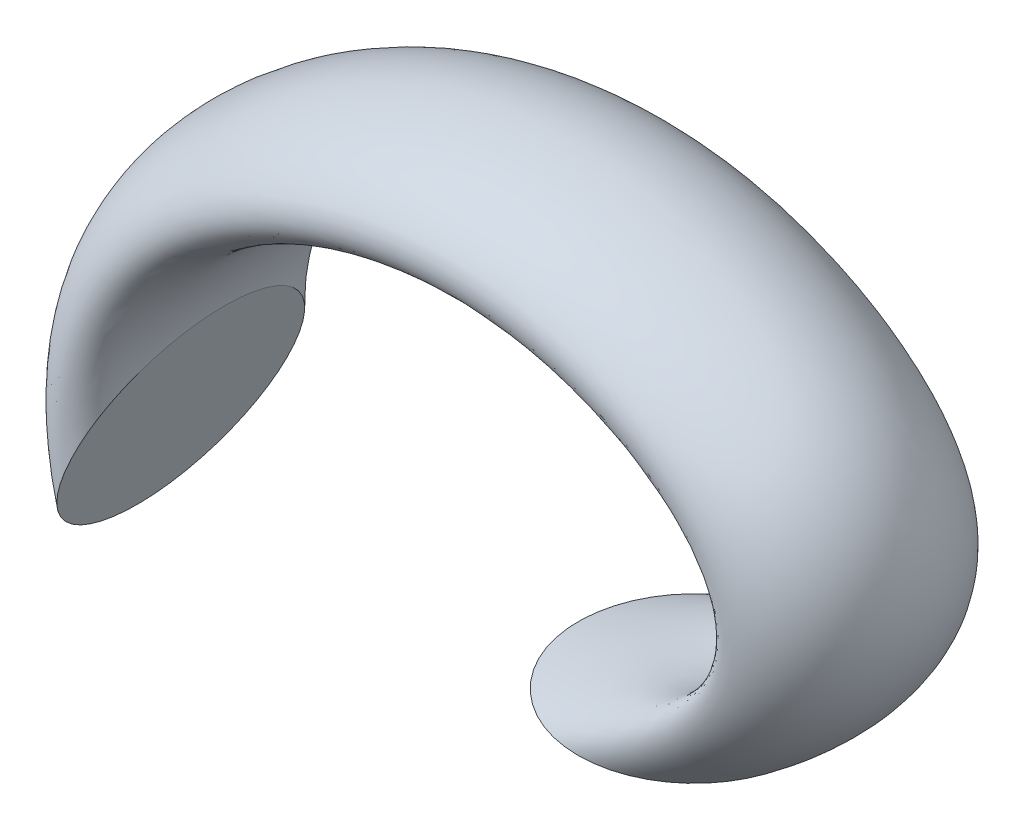
ISO-10303-21;
HEADER;
FILE_DESCRIPTION(('STEP AP214'),'2;1');
FILE_NAME('part.step','',(''),(''),'','','');
FILE_SCHEMA(('AUTOMOTIVE_DESIGN { 1 0 10303 214 1 1 1 1 }'));
ENDSEC;
DATA;
#1=APPLICATION_CONTEXT('core data for automotive mechanical design processes');
#2=APPLICATION_PROTOCOL_DEFINITION('international standard','automotive_design',2000,#1);
#3=PRODUCT_CONTEXT('',#1,'mechanical');
#4=PRODUCT('Part','Part','',(#3));
#5=PRODUCT_RELATED_PRODUCT_CATEGORY('part','',(#4));
#6=PRODUCT_DEFINITION_FORMATION('','',#4);
#7=PRODUCT_DEFINITION_CONTEXT('part definition',#1,'design');
#8=PRODUCT_DEFINITION('design','',#6,#7);
#9=PRODUCT_DEFINITION_SHAPE('','',#8);
#10=(LENGTH_UNIT() NAMED_UNIT(*) SI_UNIT(.MILLI.,.METRE.));
#11=(NAMED_UNIT(*) PLANE_ANGLE_UNIT() SI_UNIT($,.RADIAN.));
#12=(NAMED_UNIT(*) SI_UNIT($,.STERADIAN.) SOLID_ANGLE_UNIT());
#13=UNCERTAINTY_MEASURE_WITH_UNIT(LENGTH_MEASURE(1.E-05),#10,'distance_accuracy_value','');
#14=(GEOMETRIC_REPRESENTATION_CONTEXT(3) GLOBAL_UNCERTAINTY_ASSIGNED_CONTEXT((#13)) GLOBAL_UNIT_ASSIGNED_CONTEXT((#10,
#11,#12)) REPRESENTATION_CONTEXT('',''));
#15=CARTESIAN_POINT('',(0.,0.,0.));
#16=DIRECTION('',(0.,0.,1.));
#17=DIRECTION('',(1.,0.,0.));
#18=AXIS2_PLACEMENT_3D('',#15,#16,#17);
#19=CARTESIAN_POINT('',(43.7788582991507,0.,68.9517018211618));
#20=DIRECTION('',(0.,1.,0.));
#21=DIRECTION('',(0.,0.,1.));
#22=AXIS2_PLACEMENT_3D('',#19,#20,#21);
#23=PLANE('',#22);
#24=CARTESIAN_POINT('',(43.7788582991507,0.,68.9517018211618));
#25=DIRECTION('',(0.,1.,0.));
#26=DIRECTION('',(0.,0.,1.));
#27=AXIS2_PLACEMENT_3D('',#24,#25,#26);
#28=CIRCLE('',#27,52.3683720405535);
#29=CARTESIAN_POINT('',(43.7788582991507,0.,121.320073861715));
#30=VERTEX_POINT('',#29);
#31=EDGE_CURVE('E50',#30,#30,#28,.T.);
#32=ORIENTED_EDGE('',*,*,#31,.F.);
#33=EDGE_LOOP('',(#32));
#34=FACE_BOUND('',#33,.T.);
#35=ADVANCED_FACE('F43',(#34),#23,.F.);
#36=CARTESIAN_POINT('',(-187.880643247411,-5.14997576686938,68.9517018211618));
#37=DIRECTION('',(0.92733372595367,-0.374235434865384,0.));
#38=DIRECTION('',(0.,0.,1.));
#39=AXIS2_PLACEMENT_3D('',#36,#37,#38);
#40=PLANE('',#39);
#41=CARTESIAN_POINT('',(-187.880643247411,-5.14997576686938,68.9517018211618));
#42=DIRECTION('',(0.92733372595367,-0.374235434865384,0.));
#43=DIRECTION('',(0.,0.,1.));
#44=AXIS2_PLACEMENT_3D('',#41,#42,#43);
#45=CIRCLE('',#44,52.3683720405535);
#46=CARTESIAN_POINT('',(-187.880643247411,-5.14997576686938,121.320073861715));
#47=VERTEX_POINT('',#46);
#48=EDGE_CURVE('E10',#47,#47,#45,.T.);
#49=ORIENTED_EDGE('',*,*,#48,.T.);
#50=EDGE_LOOP('',(#49));
#51=FACE_BOUND('',#50,.T.);
#52=ADVANCED_FACE('F60',(#51),#40,.T.);
#53=CARTESIAN_POINT('',(43.7788582991507,0.,121.320073861715));
#54=CARTESIAN_POINT('',(50.8208120673313,3.86348954815709,121.320073861715));
#55=CARTESIAN_POINT('',(57.2136849046735,7.73593709271516,121.320073861715));
#56=CARTESIAN_POINT('',(68.7764045608907,15.4767923931756,121.320073861715));
#57=CARTESIAN_POINT('',(73.9462513797051,19.3452001490155,121.320073861715));
#58=CARTESIAN_POINT('',(83.1380548427577,27.0560200901852,121.320073861715));
#59=CARTESIAN_POINT('',(87.1600114869644,30.8984322755763,121.320073861715));
#60=CARTESIAN_POINT('',(94.1311704450205,38.5353052946656,121.320073861715));
#61=CARTESIAN_POINT('',(97.080372758458,42.329766128045,121.320073861715));
#62=CARTESIAN_POINT('',(101.98115889866,49.8487806612818,121.320073861715));
#63=CARTESIAN_POINT('',(103.93274272514,53.5733343612022,121.320073861715));
#64=CARTESIAN_POINT('',(106.913427735708,60.9305788455651,121.320073861715));
#65=CARTESIAN_POINT('',(107.942528919063,64.5632696302483,121.320073861715));
#66=CARTESIAN_POINT('',(109.153384487101,71.7148325026277,121.320073861715));
#67=CARTESIAN_POINT('',(109.335138871296,75.2337045904485,121.320073861715));
#68=CARTESIAN_POINT('',(108.926436684757,82.1356742875165,121.320073861715));
#69=CARTESIAN_POINT('',(108.335980113503,85.5187718969647,121.320073861715));
#70=CARTESIAN_POINT('',(106.45799186,92.1272368553821,121.320073861715));
#71=CARTESIAN_POINT('',(105.170460177127,95.3526042047788,121.320073861715));
#72=CARTESIAN_POINT('',(101.973457544373,101.623652861554,121.320073861715));
#73=CARTESIAN_POINT('',(100.063986593798,104.669334169197,121.320073861715));
#74=CARTESIAN_POINT('',(95.6982412692335,110.55905496104,121.320073861715));
#75=CARTESIAN_POINT('',(93.2419668947788,113.403094445349,121.320073861715));
#76=CARTESIAN_POINT('',(87.8577505663072,118.867575809021,121.320073861715));
#77=CARTESIAN_POINT('',(84.9298086117539,121.488017688432,121.320073861715));
#78=CARTESIAN_POINT('',(75.5511851444674,128.981013246702,121.320073861715));
#79=CARTESIAN_POINT('',(68.5057060267381,133.485236846057,121.320073861715));
#80=CARTESIAN_POINT('',(53.4297075975193,141.33582424521,121.320073861715));
#81=CARTESIAN_POINT('',(45.3991882854172,144.682188045618,121.320073861715));
#82=CARTESIAN_POINT('',(24.1838410922433,151.596009917086,121.320073861715));
#83=CARTESIAN_POINT('',(10.7116427782938,154.165403727354,121.320073861715));
#84=CARTESIAN_POINT('',(-16.4929882116219,156.230463330812,121.320073861715));
#85=CARTESIAN_POINT('',(-30.225420887943,155.726129122161,121.320073861715));
#86=CARTESIAN_POINT('',(-57.2520606588267,151.899639242845,121.320073861715));
#87=CARTESIAN_POINT('',(-70.5462677532173,148.577483571402,121.320073861715));
#88=CARTESIAN_POINT('',(-95.9979964148526,139.371257320852,121.320073861715));
#89=CARTESIAN_POINT('',(-108.1555179827,133.487186741725,121.320073861715));
#90=CARTESIAN_POINT('',(-130.635415646024,119.41303723052,121.320073861715));
#91=CARTESIAN_POINT('',(-140.957791742216,111.222958299156,121.320073861715));
#92=CARTESIAN_POINT('',(-154.541151824065,97.4002635534034,121.320073861715));
#93=CARTESIAN_POINT('',(-158.752237841053,92.5364359138809,121.320073861715));
#94=CARTESIAN_POINT('',(-166.453701027593,82.3282435042159,121.320073861715));
#95=CARTESIAN_POINT('',(-169.944078197276,76.9838787347264,121.320073861715));
#96=CARTESIAN_POINT('',(-176.116816196809,65.8466003850512,121.320073861715));
#97=CARTESIAN_POINT('',(-178.799177026208,60.0536868049968,121.320073861715));
#98=CARTESIAN_POINT('',(-183.268574851776,48.0512991538965,121.320073861715));
#99=CARTESIAN_POINT('',(-185.055611847982,41.8418250828134,121.320073861715));
#100=CARTESIAN_POINT('',(-187.647054513801,29.0383047691713,121.320073861715));
#101=CARTESIAN_POINT('',(-188.451460183446,22.4442585264733,121.320073861715));
#102=CARTESIAN_POINT('',(-188.990332703469,8.90358218912008,121.320073861715));
#103=CARTESIAN_POINT('',(-188.724799553583,1.95695209433072,121.320073861715));
#104=CARTESIAN_POINT('',(-187.880643247411,-5.14997576686938,121.320073861715));
#105=CARTESIAN_POINT('',(148.515602380258,0.,121.320073861715));
#106=CARTESIAN_POINT('',(155.557556148299,6.64583333488335,121.320073861715));
#107=CARTESIAN_POINT('',(161.842909409288,13.5714250583775,121.320073861715));
#108=CARTESIAN_POINT('',(172.807513026626,28.0806017988312,121.320073861715));
#109=CARTESIAN_POINT('',(177.487868708877,35.6660804671193,121.320073861715));
#110=CARTESIAN_POINT('',(185.050848000334,51.5717343214343,121.320073861715));
#111=CARTESIAN_POINT('',(187.933309443948,59.8960916493379,121.320073861715));
#112=CARTESIAN_POINT('',(191.586907276357,77.245784351496,121.320073861715));
#113=CARTESIAN_POINT('',(192.353228872741,86.2771370492782,121.320073861715));
#114=CARTESIAN_POINT('',(191.398489439186,104.738028441099,121.320073861715));
#115=CARTESIAN_POINT('',(189.665172226825,114.168900587686,121.320073861715));
#116=CARTESIAN_POINT('',(183.524097366581,132.71273131404,121.320073861715));
#117=CARTESIAN_POINT('',(179.106086102483,141.811618956173,121.320073861715));
#118=CARTESIAN_POINT('',(167.991164761324,158.718711478389,121.320073861715));
#119=CARTESIAN_POINT('',(161.305525038441,166.506575863498,121.320073861715));
#120=CARTESIAN_POINT('',(146.681252498693,180.147061135156,121.320073861715));
#121=CARTESIAN_POINT('',(138.765425419601,185.999824015252,121.320073861715));
#122=CARTESIAN_POINT('',(122.746618604627,195.843550015662,121.320073861715));
#123=CARTESIAN_POINT('',(114.650547879537,199.849871341193,121.320073861715));
#124=CARTESIAN_POINT('',(98.8473955110982,206.50348237289,121.320073861715));
#125=CARTESIAN_POINT('',(91.1336081766897,209.160553240774,121.320073861715));
#126=CARTESIAN_POINT('',(76.2116032774389,213.604857698251,121.320073861715));
#127=CARTESIAN_POINT('',(68.9962658571678,215.393582654131,121.320073861715));
#128=CARTESIAN_POINT('',(54.9792591209551,218.411126601134,121.320073861715));
#129=CARTESIAN_POINT('',(48.174036467855,219.638378411743,121.320073861715));
#130=CARTESIAN_POINT('',(28.1804859730203,222.707106530481,121.320073861715));
#131=CARTESIAN_POINT('',(15.3920280697379,223.960545966617,121.320073861715));
#132=CARTESIAN_POINT('',(-9.80826077921128,225.048449948724,121.320073861715));
#133=CARTESIAN_POINT('',(-22.2153385824235,224.865767450707,121.320073861715));
#134=CARTESIAN_POINT('',(-53.9611486348019,221.891185939983,121.320073861715));
#135=CARTESIAN_POINT('',(-72.7263017608972,217.96364821413,121.320073861715));
#136=CARTESIAN_POINT('',(-108.551295774159,206.800954699129,121.320073861715));
#137=CARTESIAN_POINT('',(-125.628347146845,199.558427046968,121.320073861715));
#138=CARTESIAN_POINT('',(-157.809697378949,182.084906799408,121.320073861715));
#139=CARTESIAN_POINT('',(-172.920261208228,171.844919043888,121.320073861715));
#140=CARTESIAN_POINT('',(-200.595071193078,148.385692259455,121.320073861715));
#141=CARTESIAN_POINT('',(-213.16234433155,135.156903718756,121.320073861715));
#142=CARTESIAN_POINT('',(-234.754972700049,105.689357930698,121.320073861715));
#143=CARTESIAN_POINT('',(-243.777258846104,89.4333468213764,121.320073861715));
#144=CARTESIAN_POINT('',(-253.571203350093,63.0193740762715,121.320073861715));
#145=CARTESIAN_POINT('',(-256.209016875631,53.880805627887,121.320073861715));
#146=CARTESIAN_POINT('',(-260.036759424675,35.059937911259,121.320073861715));
#147=CARTESIAN_POINT('',(-261.225173665042,25.3773984891202,121.320073861715));
#148=CARTESIAN_POINT('',(-261.989197019169,5.66851961631755,121.320073861715));
#149=CARTESIAN_POINT('',(-261.563055699231,-4.35693814923435,121.320073861715));
#150=CARTESIAN_POINT('',(-259.015338331173,-24.4815626565695,121.320073861715));
#151=CARTESIAN_POINT('',(-256.892871451983,-34.5784578538763,121.320073861715));
#152=CARTESIAN_POINT('',(-250.996576920667,-54.5529000454617,121.320073861715));
#153=CARTESIAN_POINT('',(-247.223841227708,-64.4277063527321,121.320073861715));
#154=CARTESIAN_POINT('',(-238.198326665279,-83.7220319025155,121.320073861715));
#155=CARTESIAN_POINT('',(-232.948385030257,-93.1401082959696,121.320073861715));
#156=CARTESIAN_POINT('',(-227.076844214988,-102.275890899858,121.320073861715));
#157=CARTESIAN_POINT('',(148.515602380258,0.,16.5833297806083));
#158=CARTESIAN_POINT('',(155.557556148355,6.64583333488335,16.5833297806083));
#159=CARTESIAN_POINT('',(161.842909409192,13.5714250583775,16.5833297806083));
#160=CARTESIAN_POINT('',(172.807513026722,28.0806017988312,16.5833297806083));
#161=CARTESIAN_POINT('',(177.487868708877,35.6660804671401,16.5833297806083));
#162=CARTESIAN_POINT('',(185.050848000334,51.5717343214135,16.5833297806083));
#163=CARTESIAN_POINT('',(187.933309443912,59.8960916493559,16.5833297806083));
#164=CARTESIAN_POINT('',(191.586907276393,77.245784351478,16.5833297806083));
#165=CARTESIAN_POINT('',(192.353228872678,86.2771370492938,16.5833297806083));
#166=CARTESIAN_POINT('',(191.398489439248,104.738028441084,16.5833297806083));
#167=CARTESIAN_POINT('',(189.665172226798,114.168900587714,16.5833297806083));
#168=CARTESIAN_POINT('',(183.524097366609,132.712731314013,16.5833297806083));
#169=CARTESIAN_POINT('',(179.106086102458,141.811618956148,16.5833297806083));
#170=CARTESIAN_POINT('',(167.991164761349,158.718711478415,16.5833297806083));
#171=CARTESIAN_POINT('',(161.305525038465,166.506575863546,16.5833297806083));
#172=CARTESIAN_POINT('',(146.681252498669,180.147061135108,16.5833297806083));
#173=CARTESIAN_POINT('',(138.765425419601,185.999824015276,16.5833297806083));
#174=CARTESIAN_POINT('',(122.746618604627,195.843550015638,16.5833297806083));
#175=CARTESIAN_POINT('',(114.650547879525,199.849871341193,16.5833297806083));
#176=CARTESIAN_POINT('',(98.8473955111104,206.50348237289,16.5833297806083));
#177=CARTESIAN_POINT('',(91.1336081767025,209.160553240749,16.5833297806083));
#178=CARTESIAN_POINT('',(76.2116032774262,213.604857698276,16.5833297806083));
#179=CARTESIAN_POINT('',(68.9962658571678,215.393582654105,16.5833297806083));
#180=CARTESIAN_POINT('',(54.9792591209551,218.411126601161,16.5833297806083));
#181=CARTESIAN_POINT('',(48.1740364678828,219.638378411715,16.5833297806083));
#182=CARTESIAN_POINT('',(28.1804859729647,222.707106530536,16.5833297806083));
#183=CARTESIAN_POINT('',(15.3920280697379,223.960545966499,16.5833297806083));
#184=CARTESIAN_POINT('',(-9.8082607792113,225.048449948842,16.5833297806083));
#185=CARTESIAN_POINT('',(-22.2153385824535,224.865767450527,16.5833297806083));
#186=CARTESIAN_POINT('',(-53.9611486347545,221.891185940267,16.5833297806083));
#187=CARTESIAN_POINT('',(-72.7263017609919,217.963648214035,16.5833297806083));
#188=CARTESIAN_POINT('',(-108.551295774064,206.800954699223,16.5833297806083));
#189=CARTESIAN_POINT('',(-125.628347146845,199.558427047158,16.5833297806083));
#190=CARTESIAN_POINT('',(-157.809697378949,182.084906799218,16.5833297806083));
#191=CARTESIAN_POINT('',(-172.920261208134,171.844919043888,16.5833297806083));
#192=CARTESIAN_POINT('',(-200.595071193172,148.385692259455,16.5833297806083));
#193=CARTESIAN_POINT('',(-213.162344331365,135.156903718756,16.5833297806083));
#194=CARTESIAN_POINT('',(-234.754972700233,105.689357930698,16.5833297806083));
#195=CARTESIAN_POINT('',(-243.777258846463,89.4333468212868,16.5833297806083));
#196=CARTESIAN_POINT('',(-253.571203349914,63.0193740763163,16.5833297806083));
#197=CARTESIAN_POINT('',(-256.209016875543,53.880805627876,16.5833297806083));
#198=CARTESIAN_POINT('',(-260.036759424763,35.0599379112701,16.5833297806083));
#199=CARTESIAN_POINT('',(-261.225173665042,25.377398489076,16.5833297806083));
#200=CARTESIAN_POINT('',(-261.989197019169,5.66851961636171,16.5833297806083));
#201=CARTESIAN_POINT('',(-261.56305569932,-4.35693814925658,16.5833297806083));
#202=CARTESIAN_POINT('',(-259.015338331084,-24.4815626565473,16.5833297806083));
#203=CARTESIAN_POINT('',(-256.892871452073,-34.5784578538536,16.5833297806083));
#204=CARTESIAN_POINT('',(-250.996576920576,-54.5529000454844,16.5833297806083));
#205=CARTESIAN_POINT('',(-247.223841227708,-64.4277063527322,16.5833297806083));
#206=CARTESIAN_POINT('',(-238.198326665279,-83.7220319025156,16.5833297806083));
#207=CARTESIAN_POINT('',(-232.94838502991,-93.140108295771,16.5833297806083));
#208=CARTESIAN_POINT('',(-227.076844214988,-102.275890899858,16.5833297806083));
#209=CARTESIAN_POINT('',(43.7788582991507,0.,16.5833297806083));
#210=CARTESIAN_POINT('',(50.8208120673313,3.86348954815709,16.5833297806083));
#211=CARTESIAN_POINT('',(57.2136849046252,7.73593709271516,16.5833297806083));
#212=CARTESIAN_POINT('',(68.776404560939,15.4767923931756,16.5833297806083));
#213=CARTESIAN_POINT('',(73.9462513796635,19.3452001490155,16.5833297806083));
#214=CARTESIAN_POINT('',(83.1380548427994,27.0560200901852,16.5833297806083));
#215=CARTESIAN_POINT('',(87.1600114869285,30.8984322755763,16.5833297806083));
#216=CARTESIAN_POINT('',(94.1311704450564,38.5353052946656,16.5833297806083));
#217=CARTESIAN_POINT('',(97.0803727584269,42.3297661280605,16.5833297806083));
#218=CARTESIAN_POINT('',(101.981158898691,49.8487806612662,16.5833297806083));
#219=CARTESIAN_POINT('',(103.932742725112,53.573334361216,16.5833297806083));
#220=CARTESIAN_POINT('',(106.913427735736,60.9305788455514,16.5833297806083));
#221=CARTESIAN_POINT('',(107.942528919038,64.5632696302232,16.5833297806083));
#222=CARTESIAN_POINT('',(109.153384487127,71.7148325026529,16.5833297806083));
#223=CARTESIAN_POINT('',(109.33513887132,75.2337045904725,16.5833297806083));
#224=CARTESIAN_POINT('',(108.926436684733,82.1356742874925,16.5833297806083));
#225=CARTESIAN_POINT('',(108.335980113503,85.5187718969647,16.5833297806083));
#226=CARTESIAN_POINT('',(106.45799186,92.1272368553821,16.5833297806083));
#227=CARTESIAN_POINT('',(105.170460177127,95.3526042048032,16.5833297806083));
#228=CARTESIAN_POINT('',(101.973457544373,101.62365286153,16.5833297806083));
#229=CARTESIAN_POINT('',(100.063986593798,104.669334169171,16.5833297806083));
#230=CARTESIAN_POINT('',(95.6982412692335,110.559054961066,16.5833297806083));
#231=CARTESIAN_POINT('',(93.2419668947788,113.403094445349,16.5833297806083));
#232=CARTESIAN_POINT('',(87.8577505663072,118.867575809021,16.5833297806083));
#233=CARTESIAN_POINT('',(84.9298086117816,121.488017688405,16.5833297806083));
#234=CARTESIAN_POINT('',(75.5511851444119,128.981013246757,16.5833297806083));
#235=CARTESIAN_POINT('',(68.5057060267381,133.485236845939,16.5833297806083));
#236=CARTESIAN_POINT('',(53.4297075975193,141.335824245328,16.5833297806083));
#237=CARTESIAN_POINT('',(45.3991882853872,144.682188045498,16.5833297806083));
#238=CARTESIAN_POINT('',(24.1838410922907,151.596009917276,16.5833297806083));
#239=CARTESIAN_POINT('',(10.7116427782464,154.165403727354,16.5833297806083));
#240=CARTESIAN_POINT('',(-16.4929882115746,156.230463330812,16.5833297806083));
#241=CARTESIAN_POINT('',(-30.225420887943,155.72612912235,16.5833297806083));
#242=CARTESIAN_POINT('',(-57.2520606588267,151.899639242656,16.5833297806083));
#243=CARTESIAN_POINT('',(-70.5462677532173,148.577483571402,16.5833297806083));
#244=CARTESIAN_POINT('',(-95.9979964148526,139.371257320852,16.5833297806083));
#245=CARTESIAN_POINT('',(-108.155517982608,133.487186741725,16.5833297806083));
#246=CARTESIAN_POINT('',(-130.635415646117,119.41303723052,16.5833297806083));
#247=CARTESIAN_POINT('',(-140.957791742395,111.222958299156,16.5833297806083));
#248=CARTESIAN_POINT('',(-154.541151823976,97.4002635534034,16.5833297806083));
#249=CARTESIAN_POINT('',(-158.752237841053,92.5364359138809,16.5833297806083));
#250=CARTESIAN_POINT('',(-166.453701027593,82.3282435042159,16.5833297806083));
#251=CARTESIAN_POINT('',(-169.944078197276,76.9838787346822,16.5833297806083));
#252=CARTESIAN_POINT('',(-176.116816196809,65.8466003850954,16.5833297806083));
#253=CARTESIAN_POINT('',(-178.799177026208,60.0536868049746,16.5833297806083));
#254=CARTESIAN_POINT('',(-183.268574851776,48.0512991539187,16.5833297806083));
#255=CARTESIAN_POINT('',(-185.055611847982,41.841825082836,16.5833297806083));
#256=CARTESIAN_POINT('',(-187.647054513801,29.0383047691486,16.5833297806083));
#257=CARTESIAN_POINT('',(-188.451460183446,22.4442585264733,16.5833297806083));
#258=CARTESIAN_POINT('',(-188.990332703469,8.90358218912007,16.5833297806083));
#259=CARTESIAN_POINT('',(-188.724799553285,1.95695209433071,16.5833297806083));
#260=CARTESIAN_POINT('',(-187.880643247411,-5.14997576686939,16.5833297806083));
#261=CARTESIAN_POINT('',(-60.9578857819563,0.,16.5833297806083));
#262=CARTESIAN_POINT('',(-53.9159320136921,1.08114576143082,16.5833297806083));
#263=CARTESIAN_POINT('',(-47.4155395999415,1.90044912705278,16.5833297806083));
#264=CARTESIAN_POINT('',(-35.2547039048443,2.8729829875201,16.5833297806083));
#265=CARTESIAN_POINT('',(-29.5953659495499,3.02431983089079,16.5833297806083));
#266=CARTESIAN_POINT('',(-18.7747383147348,2.54030585895692,16.5833297806083));
#267=CARTESIAN_POINT('',(-13.6132864700547,1.90077290179669,16.5833297806083));
#268=CARTESIAN_POINT('',(-3.32456638628046,-0.175173762146831,16.5833297806083));
#269=CARTESIAN_POINT('',(1.80751664417527,-1.61760479317272,16.5833297806083));
#270=CARTESIAN_POINT('',(12.5638283581329,-5.0404671185512,16.5833297806083));
#271=CARTESIAN_POINT('',(18.2003132234273,-7.02223186528156,16.5833297806083));
#272=CARTESIAN_POINT('',(30.3027581048632,-10.8515736229101,16.5833297806083));
#273=CARTESIAN_POINT('',(36.7789717356176,-12.6850796957013,16.5833297806083));
#274=CARTESIAN_POINT('',(50.3156042129041,-15.2890464731089,16.5833297806083));
#275=CARTESIAN_POINT('',(57.3647527041752,-16.0391666826008,16.5833297806083));
#276=CARTESIAN_POINT('',(71.171620870798,-15.8757125601229,16.5833297806083));
#277=CARTESIAN_POINT('',(77.906534807404,-14.9622802213467,16.5833297806083));
#278=CARTESIAN_POINT('',(90.1693651153742,-11.5890763048735,16.5833297806083));
#279=CARTESIAN_POINT('',(95.6903724747286,-9.1446629315865,16.5833297806083));
#280=CARTESIAN_POINT('',(105.099519577636,-3.25617664983008,16.5833297806083));
#281=CARTESIAN_POINT('',(108.994365010894,0.178115097593429,16.5833297806083));
#282=CARTESIAN_POINT('',(115.184879261041,7.51325222385555,16.5833297806083));
#283=CARTESIAN_POINT('',(117.48766793239,11.4126062365936,16.5833297806083));
#284=CARTESIAN_POINT('',(120.736242011659,19.3240250168805,16.5833297806083));
#285=CARTESIAN_POINT('',(121.685580755681,23.3376569650942,16.5833297806083));
#286=CARTESIAN_POINT('',(122.921884315859,35.2549199629787,16.5833297806083));
#287=CARTESIAN_POINT('',(121.619383983738,43.0099277253796,16.5833297806083));
#288=CARTESIAN_POINT('',(116.66767597425,57.6231985418145,16.5833297806083));
#289=CARTESIAN_POINT('',(113.013715153228,64.4986086404697,16.5833297806083));
#290=CARTESIAN_POINT('',(102.328830819336,81.3008338942848,16.5833297806083));
#291=CARTESIAN_POINT('',(94.1495873174848,90.3671592406732,16.5833297806083));
#292=CARTESIAN_POINT('',(75.5653193509152,105.659971962401,16.5833297806083));
#293=CARTESIAN_POINT('',(65.1775053709593,111.893831197542,16.5833297806083));
#294=CARTESIAN_POINT('',(43.3055760612957,121.714371686093,16.5833297806083));
#295=CARTESIAN_POINT('',(31.8277257016998,125.310048098916,16.5833297806083));
#296=CARTESIAN_POINT('',(8.59907836346631,130.356822382249,16.5833297806083));
#297=CARTESIAN_POINT('',(-3.14869163385029,131.817469764694,16.5833297806083));
#298=CARTESIAN_POINT('',(-26.515858592,133.136716530343,16.5833297806083));
#299=CARTESIAN_POINT('',(-38.1383246383277,133.012569777025,16.5833297806083));
#300=CARTESIAN_POINT('',(-55.5111002980375,131.78115303049,16.5833297806083));
#301=CARTESIAN_POINT('',(-61.2954588065632,131.192066199886,16.5833297806083));
#302=CARTESIAN_POINT('',(-72.8706426304221,129.596549097162,16.5833297806083));
#303=CARTESIAN_POINT('',(-78.6629827295091,128.590358980288,16.5833297806083));
#304=CARTESIAN_POINT('',(-90.2444353744487,126.024681153829,16.5833297806083));
#305=CARTESIAN_POINT('',(-96.0352983530967,124.464311759206,16.5833297806083));
#306=CARTESIAN_POINT('',(-107.521811372468,120.584160964385,16.5833297806083));
#307=CARTESIAN_POINT('',(-113.21835224389,118.262108019526,16.5833297806083));
#308=CARTESIAN_POINT('',(-124.297532107026,112.629509583782,16.5833297806083));
#309=CARTESIAN_POINT('',(-129.679079139185,109.316223405679,16.5833297806083));
#310=CARTESIAN_POINT('',(-139.78233874166,101.529196280756,16.5833297806083));
#311=CARTESIAN_POINT('',(-144.50121407666,97.0540124844324,16.5833297806083));
#312=CARTESIAN_POINT('',(-148.684442279833,91.9759393661196,16.5833297806083));
#313=CARTESIAN_POINT('',(-60.9578857819563,0.,121.320073861715));
#314=CARTESIAN_POINT('',(-53.9159320136363,1.08114576143083,121.320073861715));
#315=CARTESIAN_POINT('',(-47.4155395999415,1.90044912705278,121.320073861715));
#316=CARTESIAN_POINT('',(-35.2547039048443,2.87298298752009,121.320073861715));
#317=CARTESIAN_POINT('',(-29.5953659494667,3.0243198309116,121.320073861715));
#318=CARTESIAN_POINT('',(-18.774738314818,2.54030585893611,121.320073861715));
#319=CARTESIAN_POINT('',(-13.6132864700188,1.90077290181462,121.320073861715));
#320=CARTESIAN_POINT('',(-3.32456638631633,-0.175173762164769,121.320073861715));
#321=CARTESIAN_POINT('',(1.80751664417527,-1.61760479318829,121.320073861715));
#322=CARTESIAN_POINT('',(12.5638283581329,-5.04046711853563,121.320073861715));
#323=CARTESIAN_POINT('',(18.2003132234548,-7.02223186528155,121.320073861715));
#324=CARTESIAN_POINT('',(30.3027581048357,-10.8515736229101,121.320073861715));
#325=CARTESIAN_POINT('',(36.7789717356428,-12.6850796956762,121.320073861715));
#326=CARTESIAN_POINT('',(50.315604212879,-15.289046473134,121.320073861715));
#327=CARTESIAN_POINT('',(57.3647527041513,-16.0391666826008,121.320073861715));
#328=CARTESIAN_POINT('',(71.1716208708219,-15.8757125601229,121.320073861715));
#329=CARTESIAN_POINT('',(77.906534807404,-14.9622802213228,121.320073861715));
#330=CARTESIAN_POINT('',(90.1693651153742,-11.5890763048973,121.320073861715));
#331=CARTESIAN_POINT('',(95.6903724747163,-9.14466293163534,121.320073861715));
#332=CARTESIAN_POINT('',(105.099519577648,-3.25617664978123,121.320073861715));
#333=CARTESIAN_POINT('',(108.994365010906,0.178115097618864,121.320073861715));
#334=CARTESIAN_POINT('',(115.184879261028,7.51325222383012,121.320073861715));
#335=CARTESIAN_POINT('',(117.48766793239,11.412606236567,121.320073861715));
#336=CARTESIAN_POINT('',(120.736242011659,19.3240250169071,121.320073861715));
#337=CARTESIAN_POINT('',(121.685580755653,23.337656965122,121.320073861715));
#338=CARTESIAN_POINT('',(122.921884315915,35.2549199629232,121.320073861715));
#339=CARTESIAN_POINT('',(121.619383983738,43.0099277254976,121.320073861715));
#340=CARTESIAN_POINT('',(116.66767597425,57.6231985416965,121.320073861715));
#341=CARTESIAN_POINT('',(113.013715153258,64.4986086405297,121.320073861715));
#342=CARTESIAN_POINT('',(102.328830819289,81.30083389419,121.320073861715));
#343=CARTESIAN_POINT('',(94.1495873174848,90.3671592405786,121.320073861715));
#344=CARTESIAN_POINT('',(75.5653193509152,105.659971962495,121.320073861715));
#345=CARTESIAN_POINT('',(65.1775053709592,111.893831197353,121.320073861715));
#346=CARTESIAN_POINT('',(43.3055760612957,121.714371686283,121.320073861715));
#347=CARTESIAN_POINT('',(31.8277257017937,125.310048098916,121.320073861715));
#348=CARTESIAN_POINT('',(8.59907836337241,130.356822382249,121.320073861715));
#349=CARTESIAN_POINT('',(-3.14869163385029,131.817469764694,121.320073861715));
#350=CARTESIAN_POINT('',(-26.515858592,133.136716530343,121.320073861715));
#351=CARTESIAN_POINT('',(-38.1383246383277,133.012569776935,121.320073861715));
#352=CARTESIAN_POINT('',(-55.5111002980375,131.781153030535,121.320073861715));
#353=CARTESIAN_POINT('',(-61.2954588064745,131.192066199875,121.320073861715));
#354=CARTESIAN_POINT('',(-72.8706426305109,129.596549097173,121.320073861715));
#355=CARTESIAN_POINT('',(-78.6629827295091,128.590358980333,121.320073861715));
#356=CARTESIAN_POINT('',(-90.2444353744487,126.024681153785,121.320073861715));
#357=CARTESIAN_POINT('',(-96.0352983531856,124.464311759228,121.320073861715));
#358=CARTESIAN_POINT('',(-107.521811372379,120.584160964362,121.320073861715));
#359=CARTESIAN_POINT('',(-113.218352243981,118.262108019503,121.320073861715));
#360=CARTESIAN_POINT('',(-124.297532106935,112.629509583804,121.320073861715));
#361=CARTESIAN_POINT('',(-129.679079139185,109.316223405679,121.320073861715));
#362=CARTESIAN_POINT('',(-139.78233874166,101.529196280756,121.320073861715));
#363=CARTESIAN_POINT('',(-144.501214076908,97.054012484631,121.320073861715));
#364=CARTESIAN_POINT('',(-148.684442279833,91.9759393661196,121.320073861715));
#365=CARTESIAN_POINT('',(43.7788582991507,0.,121.320073861715));
#366=CARTESIAN_POINT('',(50.8208120673313,3.86348954815709,121.320073861715));
#367=CARTESIAN_POINT('',(57.2136849046735,7.73593709271516,121.320073861715));
#368=CARTESIAN_POINT('',(68.7764045608907,15.4767923931756,121.320073861715));
#369=CARTESIAN_POINT('',(73.9462513797051,19.3452001490155,121.320073861715));
#370=CARTESIAN_POINT('',(83.1380548427577,27.0560200901852,121.320073861715));
#371=CARTESIAN_POINT('',(87.1600114869644,30.8984322755763,121.320073861715));
#372=CARTESIAN_POINT('',(94.1311704450205,38.5353052946656,121.320073861715));
#373=CARTESIAN_POINT('',(97.080372758458,42.329766128045,121.320073861715));
#374=CARTESIAN_POINT('',(101.98115889866,49.8487806612818,121.320073861715));
#375=CARTESIAN_POINT('',(103.93274272514,53.5733343612022,121.320073861715));
#376=CARTESIAN_POINT('',(106.913427735708,60.9305788455651,121.320073861715));
#377=CARTESIAN_POINT('',(107.942528919063,64.5632696302483,121.320073861715));
#378=CARTESIAN_POINT('',(109.153384487101,71.7148325026277,121.320073861715));
#379=CARTESIAN_POINT('',(109.335138871296,75.2337045904485,121.320073861715));
#380=CARTESIAN_POINT('',(108.926436684757,82.1356742875165,121.320073861715));
#381=CARTESIAN_POINT('',(108.335980113503,85.5187718969647,121.320073861715));
#382=CARTESIAN_POINT('',(106.45799186,92.1272368553821,121.320073861715));
#383=CARTESIAN_POINT('',(105.170460177127,95.3526042047788,121.320073861715));
#384=CARTESIAN_POINT('',(101.973457544373,101.623652861554,121.320073861715));
#385=CARTESIAN_POINT('',(100.063986593798,104.669334169197,121.320073861715));
#386=CARTESIAN_POINT('',(95.6982412692335,110.55905496104,121.320073861715));
#387=CARTESIAN_POINT('',(93.2419668947788,113.403094445349,121.320073861715));
#388=CARTESIAN_POINT('',(87.8577505663072,118.867575809021,121.320073861715));
#389=CARTESIAN_POINT('',(84.9298086117539,121.488017688432,121.320073861715));
#390=CARTESIAN_POINT('',(75.5511851444674,128.981013246702,121.320073861715));
#391=CARTESIAN_POINT('',(68.5057060267381,133.485236846057,121.320073861715));
#392=CARTESIAN_POINT('',(53.4297075975193,141.33582424521,121.320073861715));
#393=CARTESIAN_POINT('',(45.3991882854172,144.682188045618,121.320073861715));
#394=CARTESIAN_POINT('',(24.1838410922433,151.596009917086,121.320073861715));
#395=CARTESIAN_POINT('',(10.7116427782938,154.165403727354,121.320073861715));
#396=CARTESIAN_POINT('',(-16.4929882116219,156.230463330812,121.320073861715));
#397=CARTESIAN_POINT('',(-30.225420887943,155.726129122161,121.320073861715));
#398=CARTESIAN_POINT('',(-57.2520606588267,151.899639242845,121.320073861715));
#399=CARTESIAN_POINT('',(-70.5462677532173,148.577483571402,121.320073861715));
#400=CARTESIAN_POINT('',(-95.9979964148526,139.371257320852,121.320073861715));
#401=CARTESIAN_POINT('',(-108.1555179827,133.487186741725,121.320073861715));
#402=CARTESIAN_POINT('',(-130.635415646024,119.41303723052,121.320073861715));
#403=CARTESIAN_POINT('',(-140.957791742216,111.222958299156,121.320073861715));
#404=CARTESIAN_POINT('',(-154.541151824065,97.4002635534034,121.320073861715));
#405=CARTESIAN_POINT('',(-158.752237841053,92.5364359138809,121.320073861715));
#406=CARTESIAN_POINT('',(-166.453701027593,82.3282435042159,121.320073861715));
#407=CARTESIAN_POINT('',(-169.944078197276,76.9838787347264,121.320073861715));
#408=CARTESIAN_POINT('',(-176.116816196809,65.8466003850512,121.320073861715));
#409=CARTESIAN_POINT('',(-178.799177026208,60.0536868049968,121.320073861715));
#410=CARTESIAN_POINT('',(-183.268574851776,48.0512991538965,121.320073861715));
#411=CARTESIAN_POINT('',(-185.055611847982,41.8418250828134,121.320073861715));
#412=CARTESIAN_POINT('',(-187.647054513801,29.0383047691713,121.320073861715));
#413=CARTESIAN_POINT('',(-188.451460183446,22.4442585264733,121.320073861715));
#414=CARTESIAN_POINT('',(-188.990332703469,8.90358218912008,121.320073861715));
#415=CARTESIAN_POINT('',(-188.724799553583,1.95695209433072,121.320073861715));
#416=CARTESIAN_POINT('',(-187.880643247411,-5.14997576686938,121.320073861715));
#417=(BOUNDED_SURFACE() B_SPLINE_SURFACE(3,3,((#53,#54,#55,#56,#57,#58,#59,#60,#61,#62,#63,#64,
#65,#66,#67,#68,#69,#70,#71,#72,#73,#74,#75,#76,#77,#78,#79,#80,#81,#82,#83,#84,#85,#86,#87,#88,
#89,#90,#91,#92,#93,#94,#95,#96,#97,#98,#99,#100,#101,#102,#103,#104),(#105,#106,#107,#108,#109,
#110,#111,#112,#113,#114,#115,#116,#117,#118,#119,#120,#121,#122,#123,#124,#125,#126,#127,#128,
#129,#130,#131,#132,#133,#134,#135,#136,#137,#138,#139,#140,#141,#142,#143,#144,#145,#146,#147,
#148,#149,#150,#151,#152,#153,#154,#155,#156),(#157,#158,#159,#160,#161,#162,#163,#164,#165,
#166,#167,#168,#169,#170,#171,#172,#173,#174,#175,#176,#177,#178,#179,#180,#181,#182,#183,#184,
#185,#186,#187,#188,#189,#190,#191,#192,#193,#194,#195,#196,#197,#198,#199,#200,#201,#202,#203,
#204,#205,#206,#207,#208),(#209,#210,#211,#212,#213,#214,#215,#216,#217,#218,#219,#220,#221,
#222,#223,#224,#225,#226,#227,#228,#229,#230,#231,#232,#233,#234,#235,#236,#237,#238,#239,#240,
#241,#242,#243,#244,#245,#246,#247,#248,#249,#250,#251,#252,#253,#254,#255,#256,#257,#258,#259,
#260),(#261,#262,#263,#264,#265,#266,#267,#268,#269,#270,#271,#272,#273,#274,#275,#276,#277,
#278,#279,#280,#281,#282,#283,#284,#285,#286,#287,#288,#289,#290,#291,#292,#293,#294,#295,#296,
#297,#298,#299,#300,#301,#302,#303,#304,#305,#306,#307,#308,#309,#310,#311,#312),(#313,#314,
#315,#316,#317,#318,#319,#320,#321,#322,#323,#324,#325,#326,#327,#328,#329,#330,#331,#332,#333,
#334,#335,#336,#337,#338,#339,#340,#341,#342,#343,#344,#345,#346,#347,#348,#349,#350,#351,#352,
#353,#354,#355,#356,#357,#358,#359,#360,#361,#362,#363,#364),(#365,#366,#367,#368,#369,#370,
#371,#372,#373,#374,#375,#376,#377,#378,#379,#380,#381,#382,#383,#384,#385,#386,#387,#388,#389,
#390,#391,#392,#393,#394,#395,#396,#397,#398,#399,#400,#401,#402,#403,#404,#405,#406,#407,#408,
#409,#410,#411,#412,#413,#414,#415,#416)),.UNSPECIFIED.,.T.,.F.,
.F.) B_SPLINE_SURFACE_WITH_KNOTS((4,3,4),(4,2,2,2,2,2,2,2,2,2,2,2,2,2,2,2,2,2,2,2,2,2,2,2,2,4),
(0.,0.5,1.),(0.,0.0242233133126231,0.0484466266252463,0.0726699399378694,0.0968932532504926,
0.121116566563116,0.145339879875739,0.169563193188362,0.193786506500985,0.218009819813608,
0.242233133126231,0.266456446438855,0.290679759751478,0.339126386376724,0.38757301300197,
0.464126386376724,0.540679759751478,0.617233133126231,0.693786506500985,0.770339879875739,
0.808616566563116,0.846893253250493,0.885169939937869,0.923446626625246,0.961723313312623,1.),
.UNSPECIFIED.) GEOMETRIC_REPRESENTATION_ITEM() RATIONAL_B_SPLINE_SURFACE(((1.,1.,1.,1.,1.,1.,1.,
1.,1.,1.,1.,1.,1.,1.,1.,1.,1.,1.,1.,1.,1.,1.,1.,1.,1.,1.,1.,1.,1.,1.,1.,1.,1.,1.,1.,1.,1.,1.,1.,
1.,1.,1.,1.,1.,1.,1.,1.,1.,1.,1.,1.,1.),(0.333333333333333,0.333333333333333,0.333333333333333,
0.333333333333333,0.333333333333333,0.333333333333333,0.333333333333333,0.333333333333333,
0.333333333333333,0.333333333333333,0.333333333333333,0.333333333333333,0.333333333333333,
0.333333333333333,0.333333333333333,0.333333333333333,0.333333333333333,0.333333333333333,
0.333333333333333,0.333333333333333,0.333333333333333,0.333333333333333,0.333333333333333,
0.333333333333333,0.333333333333333,0.333333333333333,0.333333333333333,0.333333333333333,
0.333333333333333,0.333333333333333,0.333333333333333,0.333333333333333,0.333333333333333,
0.333333333333333,0.333333333333333,0.333333333333333,0.333333333333333,0.333333333333333,
0.333333333333333,0.333333333333333,0.333333333333333,0.333333333333333,0.333333333333333,
0.333333333333333,0.333333333333333,0.333333333333333,0.333333333333333,0.333333333333333,
0.333333333333333,0.333333333333333,0.333333333333333,0.333333333333333),(0.333333333333333,
0.333333333333333,0.333333333333333,0.333333333333333,0.333333333333333,0.333333333333333,
0.333333333333333,0.333333333333333,0.333333333333333,0.333333333333333,0.333333333333333,
0.333333333333333,0.333333333333333,0.333333333333333,0.333333333333333,0.333333333333333,
0.333333333333333,0.333333333333333,0.333333333333333,0.333333333333333,0.333333333333333,
0.333333333333333,0.333333333333333,0.333333333333333,0.333333333333333,0.333333333333333,
0.333333333333333,0.333333333333333,0.333333333333333,0.333333333333333,0.333333333333333,
0.333333333333333,0.333333333333333,0.333333333333333,0.333333333333333,0.333333333333333,
0.333333333333333,0.333333333333333,0.333333333333333,0.333333333333333,0.333333333333333,
0.333333333333333,0.333333333333333,0.333333333333333,0.333333333333333,0.333333333333333,
0.333333333333333,0.333333333333333,0.333333333333333,0.333333333333333,0.333333333333333,
0.333333333333333),(1.,1.,1.,1.,1.,1.,1.,1.,1.,1.,1.,1.,1.,1.,1.,1.,1.,1.,1.,1.,1.,1.,1.,1.,1.,
1.,1.,1.,1.,1.,1.,1.,1.,1.,1.,1.,1.,1.,1.,1.,1.,1.,1.,1.,1.,1.,1.,1.,1.,1.,1.,1.),
(0.333333333333333,0.333333333333333,0.333333333333333,0.333333333333333,0.333333333333333,
0.333333333333333,0.333333333333333,0.333333333333333,0.333333333333333,0.333333333333333,
0.333333333333333,0.333333333333333,0.333333333333333,0.333333333333333,0.333333333333333,
0.333333333333333,0.333333333333333,0.333333333333333,0.333333333333333,0.333333333333333,
0.333333333333333,0.333333333333333,0.333333333333333,0.333333333333333,0.333333333333333,
0.333333333333333,0.333333333333333,0.333333333333333,0.333333333333333,0.333333333333333,
0.333333333333333,0.333333333333333,0.333333333333333,0.333333333333333,0.333333333333333,
0.333333333333333,0.333333333333333,0.333333333333333,0.333333333333333,0.333333333333333,
0.333333333333333,0.333333333333333,0.333333333333333,0.333333333333333,0.333333333333333,
0.333333333333333,0.333333333333333,0.333333333333333,0.333333333333333,0.333333333333333,
0.333333333333333,0.333333333333333),(0.333333333333333,0.333333333333333,0.333333333333333,
0.333333333333333,0.333333333333333,0.333333333333333,0.333333333333333,0.333333333333333,
0.333333333333333,0.333333333333333,0.333333333333333,0.333333333333333,0.333333333333333,
0.333333333333333,0.333333333333333,0.333333333333333,0.333333333333333,0.333333333333333,
0.333333333333333,0.333333333333333,0.333333333333333,0.333333333333333,0.333333333333333,
0.333333333333333,0.333333333333333,0.333333333333333,0.333333333333333,0.333333333333333,
0.333333333333333,0.333333333333333,0.333333333333333,0.333333333333333,0.333333333333333,
0.333333333333333,0.333333333333333,0.333333333333333,0.333333333333333,0.333333333333333,
0.333333333333333,0.333333333333333,0.333333333333333,0.333333333333333,0.333333333333333,
0.333333333333333,0.333333333333333,0.333333333333333,0.333333333333333,0.333333333333333,
0.333333333333333,0.333333333333333,0.333333333333333,0.333333333333333),(1.,1.,1.,1.,1.,1.,1.,
1.,1.,1.,1.,1.,1.,1.,1.,1.,1.,1.,1.,1.,1.,1.,1.,1.,1.,1.,1.,1.,1.,1.,1.,1.,1.,1.,1.,1.,1.,1.,1.,
1.,1.,1.,1.,1.,1.,1.,1.,1.,1.,1.,1.,1.))) REPRESENTATION_ITEM('') SURFACE());
#418=ORIENTED_EDGE('',*,*,#48,.F.);
#419=EDGE_LOOP('',(#418));
#420=FACE_BOUND('',#419,.T.);
#421=ORIENTED_EDGE('',*,*,#31,.T.);
#422=EDGE_LOOP('',(#421));
#423=FACE_BOUND('',#422,.T.);
#424=ADVANCED_FACE('F57',(#420,#423),#417,.T.);
#425=CLOSED_SHELL('',(#35,#52,#424));
#426=MANIFOLD_SOLID_BREP('B2',#425);
#427=ADVANCED_BREP_SHAPE_REPRESENTATION('',(#18,#426),#14);
#428=SHAPE_DEFINITION_REPRESENTATION(#9,#427);
ENDSEC;
END-ISO-10303-21;
